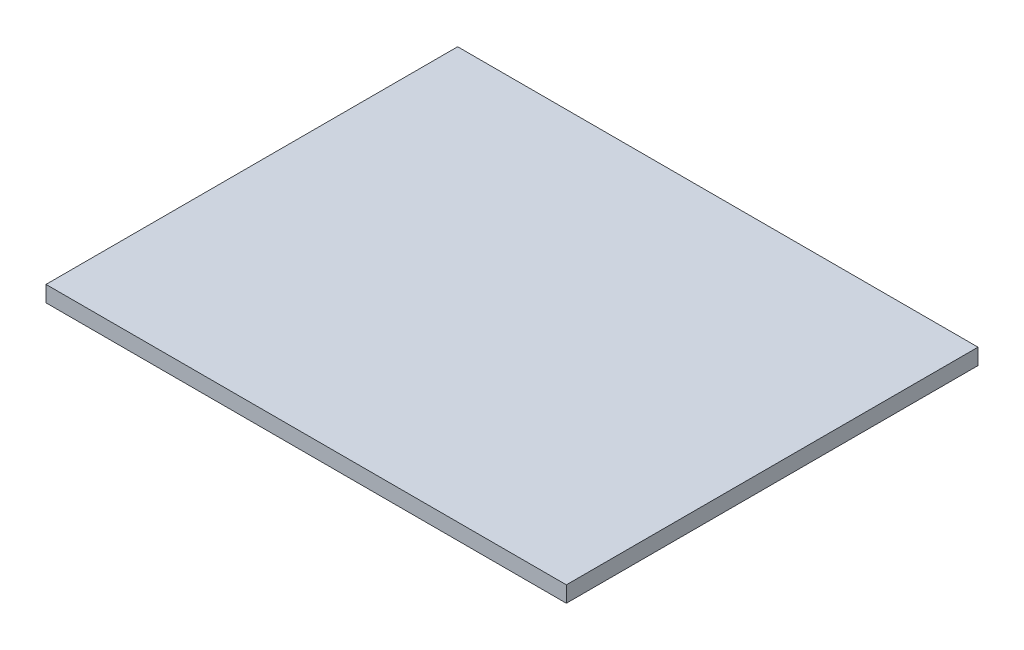
ISO-10303-21;
HEADER;
FILE_DESCRIPTION(('STEP AP214'),'2;1');
FILE_NAME('part.step','',(''),(''),'','','');
FILE_SCHEMA(('AUTOMOTIVE_DESIGN { 1 0 10303 214 1 1 1 1 }'));
ENDSEC;
DATA;
#1=APPLICATION_CONTEXT('core data for automotive mechanical design processes');
#2=APPLICATION_PROTOCOL_DEFINITION('international standard','automotive_design',2000,#1);
#3=PRODUCT_CONTEXT('',#1,'mechanical');
#4=PRODUCT('Part','Part','',(#3));
#5=PRODUCT_RELATED_PRODUCT_CATEGORY('part','',(#4));
#6=PRODUCT_DEFINITION_FORMATION('','',#4);
#7=PRODUCT_DEFINITION_CONTEXT('part definition',#1,'design');
#8=PRODUCT_DEFINITION('design','',#6,#7);
#9=PRODUCT_DEFINITION_SHAPE('','',#8);
#10=(LENGTH_UNIT() NAMED_UNIT(*) SI_UNIT(.MILLI.,.METRE.));
#11=(NAMED_UNIT(*) PLANE_ANGLE_UNIT() SI_UNIT($,.RADIAN.));
#12=(NAMED_UNIT(*) SI_UNIT($,.STERADIAN.) SOLID_ANGLE_UNIT());
#13=UNCERTAINTY_MEASURE_WITH_UNIT(LENGTH_MEASURE(1.E-05),#10,'distance_accuracy_value','');
#14=(GEOMETRIC_REPRESENTATION_CONTEXT(3) GLOBAL_UNCERTAINTY_ASSIGNED_CONTEXT((#13)) GLOBAL_UNIT_ASSIGNED_CONTEXT((#10,
#11,#12)) REPRESENTATION_CONTEXT('',''));
#15=CARTESIAN_POINT('',(0.,0.,0.));
#16=DIRECTION('',(0.,0.,1.));
#17=DIRECTION('',(1.,0.,0.));
#18=AXIS2_PLACEMENT_3D('',#15,#16,#17);
#19=CARTESIAN_POINT('',(-32.55,2.,-25.75));
#20=DIRECTION('',(1.,0.,0.));
#21=DIRECTION('',(0.,0.,-1.));
#22=AXIS2_PLACEMENT_3D('',#19,#20,#21);
#23=PLANE('',#22);
#24=DIRECTION('',(0.,0.,1.));
#25=VECTOR('',#24,1.);
#26=CARTESIAN_POINT('',(-32.55,0.,-25.75));
#27=LINE('',#26,#25);
#28=CARTESIAN_POINT('',(-32.55,0.,-25.75));
#29=VERTEX_POINT('',#28);
#30=CARTESIAN_POINT('',(-32.55,0.,25.75));
#31=VERTEX_POINT('',#30);
#32=EDGE_CURVE('E107',#29,#31,#27,.T.);
#33=ORIENTED_EDGE('',*,*,#32,.T.);
#34=DIRECTION('',(0.,-1.,0.));
#35=VECTOR('',#34,1.);
#36=CARTESIAN_POINT('',(-32.55,2.,25.75));
#37=LINE('',#36,#35);
#38=CARTESIAN_POINT('',(-32.55,2.,25.75));
#39=VERTEX_POINT('',#38);
#40=EDGE_CURVE('E11',#39,#31,#37,.T.);
#41=ORIENTED_EDGE('',*,*,#40,.F.);
#42=DIRECTION('',(0.,0.,1.));
#43=VECTOR('',#42,1.);
#44=CARTESIAN_POINT('',(-32.55,2.,-25.75));
#45=LINE('',#44,#43);
#46=CARTESIAN_POINT('',(-32.55,2.,-25.75));
#47=VERTEX_POINT('',#46);
#48=EDGE_CURVE('E91',#47,#39,#45,.T.);
#49=ORIENTED_EDGE('',*,*,#48,.F.);
#50=DIRECTION('',(0.,-1.,0.));
#51=VECTOR('',#50,1.);
#52=CARTESIAN_POINT('',(-32.55,2.,-25.75));
#53=LINE('',#52,#51);
#54=EDGE_CURVE('E103',#47,#29,#53,.T.);
#55=ORIENTED_EDGE('',*,*,#54,.T.);
#56=EDGE_LOOP('',(#33,#41,#49,#55));
#57=FACE_BOUND('',#56,.T.);
#58=ADVANCED_FACE('F39',(#57),#23,.F.);
#59=CARTESIAN_POINT('',(32.55,2.,25.75));
#60=DIRECTION('',(0.,0.,-1.));
#61=DIRECTION('',(-1.,0.,0.));
#62=AXIS2_PLACEMENT_3D('',#59,#60,#61);
#63=PLANE('',#62);
#64=DIRECTION('',(1.,0.,0.));
#65=VECTOR('',#64,1.);
#66=CARTESIAN_POINT('',(32.55,0.,25.75));
#67=LINE('',#66,#65);
#68=CARTESIAN_POINT('',(32.55,0.,25.75));
#69=VERTEX_POINT('',#68);
#70=EDGE_CURVE('E96',#31,#69,#67,.T.);
#71=ORIENTED_EDGE('',*,*,#70,.T.);
#72=DIRECTION('',(0.,-1.,0.));
#73=VECTOR('',#72,1.);
#74=CARTESIAN_POINT('',(32.55,2.,25.75));
#75=LINE('',#74,#73);
#76=CARTESIAN_POINT('',(32.55,2.,25.75));
#77=VERTEX_POINT('',#76);
#78=EDGE_CURVE('E48',#77,#69,#75,.T.);
#79=ORIENTED_EDGE('',*,*,#78,.F.);
#80=DIRECTION('',(1.,0.,0.));
#81=VECTOR('',#80,1.);
#82=CARTESIAN_POINT('',(32.55,2.,25.75));
#83=LINE('',#82,#81);
#84=EDGE_CURVE('E86',#39,#77,#83,.T.);
#85=ORIENTED_EDGE('',*,*,#84,.F.);
#86=ORIENTED_EDGE('',*,*,#40,.T.);
#87=EDGE_LOOP('',(#71,#79,#85,#86));
#88=FACE_BOUND('',#87,.T.);
#89=ADVANCED_FACE('F95',(#88),#63,.F.);
#90=CARTESIAN_POINT('',(32.55,2.,-25.75));
#91=DIRECTION('',(-1.,0.,0.));
#92=DIRECTION('',(0.,0.,1.));
#93=AXIS2_PLACEMENT_3D('',#90,#91,#92);
#94=PLANE('',#93);
#95=DIRECTION('',(0.,0.,-1.));
#96=VECTOR('',#95,1.);
#97=CARTESIAN_POINT('',(32.55,0.,-25.75));
#98=LINE('',#97,#96);
#99=CARTESIAN_POINT('',(32.55,0.,-25.75));
#100=VERTEX_POINT('',#99);
#101=EDGE_CURVE('E73',#69,#100,#98,.T.);
#102=ORIENTED_EDGE('',*,*,#101,.T.);
#103=DIRECTION('',(0.,-1.,0.));
#104=VECTOR('',#103,1.);
#105=CARTESIAN_POINT('',(32.55,2.,-25.75));
#106=LINE('',#105,#104);
#107=CARTESIAN_POINT('',(32.55,2.,-25.75));
#108=VERTEX_POINT('',#107);
#109=EDGE_CURVE('E98',#108,#100,#106,.T.);
#110=ORIENTED_EDGE('',*,*,#109,.F.);
#111=DIRECTION('',(0.,0.,-1.));
#112=VECTOR('',#111,1.);
#113=CARTESIAN_POINT('',(32.55,2.,-25.75));
#114=LINE('',#113,#112);
#115=EDGE_CURVE('E89',#77,#108,#114,.T.);
#116=ORIENTED_EDGE('',*,*,#115,.F.);
#117=ORIENTED_EDGE('',*,*,#78,.T.);
#118=EDGE_LOOP('',(#102,#110,#116,#117));
#119=FACE_BOUND('',#118,.T.);
#120=ADVANCED_FACE('F99',(#119),#94,.F.);
#121=CARTESIAN_POINT('',(32.55,2.,-25.75));
#122=DIRECTION('',(0.,0.,1.));
#123=DIRECTION('',(1.,0.,0.));
#124=AXIS2_PLACEMENT_3D('',#121,#122,#123);
#125=PLANE('',#124);
#126=DIRECTION('',(-1.,0.,0.));
#127=VECTOR('',#126,1.);
#128=CARTESIAN_POINT('',(32.55,0.,-25.75));
#129=LINE('',#128,#127);
#130=EDGE_CURVE('E79',#100,#29,#129,.T.);
#131=ORIENTED_EDGE('',*,*,#130,.T.);
#132=ORIENTED_EDGE('',*,*,#54,.F.);
#133=DIRECTION('',(-1.,0.,0.));
#134=VECTOR('',#133,1.);
#135=CARTESIAN_POINT('',(32.55,2.,-25.75));
#136=LINE('',#135,#134);
#137=EDGE_CURVE('E56',#108,#47,#136,.T.);
#138=ORIENTED_EDGE('',*,*,#137,.F.);
#139=ORIENTED_EDGE('',*,*,#109,.T.);
#140=EDGE_LOOP('',(#131,#132,#138,#139));
#141=FACE_BOUND('',#140,.T.);
#142=ADVANCED_FACE('F120',(#141),#125,.F.);
#143=CARTESIAN_POINT('',(0.,2.,0.));
#144=DIRECTION('',(0.,-1.,0.));
#145=DIRECTION('',(0.,0.,-1.));
#146=AXIS2_PLACEMENT_3D('',#143,#144,#145);
#147=PLANE('',#146);
#148=ORIENTED_EDGE('',*,*,#48,.T.);
#149=ORIENTED_EDGE('',*,*,#84,.T.);
#150=ORIENTED_EDGE('',*,*,#115,.T.);
#151=ORIENTED_EDGE('',*,*,#137,.T.);
#152=EDGE_LOOP('',(#148,#149,#150,#151));
#153=FACE_BOUND('',#152,.T.);
#154=ADVANCED_FACE('F87',(#153),#147,.F.);
#155=CARTESIAN_POINT('',(0.,0.,0.));
#156=DIRECTION('',(0.,-1.,0.));
#157=DIRECTION('',(0.,0.,-1.));
#158=AXIS2_PLACEMENT_3D('',#155,#156,#157);
#159=PLANE('',#158);
#160=ORIENTED_EDGE('',*,*,#32,.F.);
#161=ORIENTED_EDGE('',*,*,#130,.F.);
#162=ORIENTED_EDGE('',*,*,#101,.F.);
#163=ORIENTED_EDGE('',*,*,#70,.F.);
#164=EDGE_LOOP('',(#160,#161,#162,#163));
#165=FACE_BOUND('',#164,.T.);
#166=ADVANCED_FACE('F123',(#165),#159,.T.);
#167=CLOSED_SHELL('',(#58,#89,#120,#142,#154,#166));
#168=MANIFOLD_SOLID_BREP('B2',#167);
#169=ADVANCED_BREP_SHAPE_REPRESENTATION('',(#18,#168),#14);
#170=SHAPE_DEFINITION_REPRESENTATION(#9,#169);
ENDSEC;
END-ISO-10303-21;
